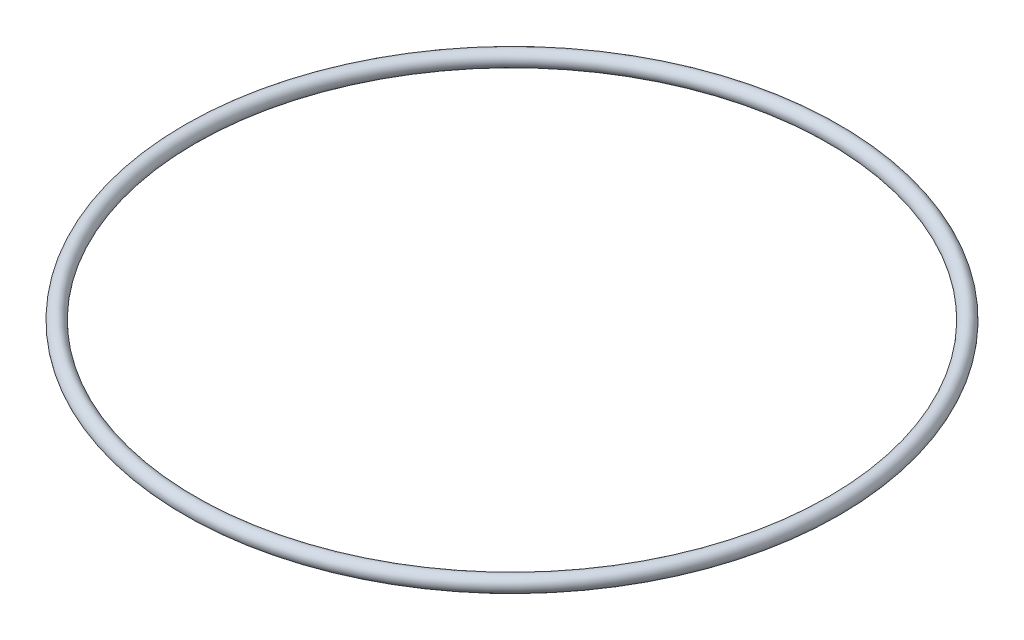
ISO-10303-21;
HEADER;
FILE_DESCRIPTION(('STEP AP214'),'2;1');
FILE_NAME('part.step','',(''),(''),'','','');
FILE_SCHEMA(('AUTOMOTIVE_DESIGN { 1 0 10303 214 1 1 1 1 }'));
ENDSEC;
DATA;
#1=APPLICATION_CONTEXT('core data for automotive mechanical design processes');
#2=APPLICATION_PROTOCOL_DEFINITION('international standard','automotive_design',2000,#1);
#3=PRODUCT_CONTEXT('',#1,'mechanical');
#4=PRODUCT('Part','Part','',(#3));
#5=PRODUCT_RELATED_PRODUCT_CATEGORY('part','',(#4));
#6=PRODUCT_DEFINITION_FORMATION('','',#4);
#7=PRODUCT_DEFINITION_CONTEXT('part definition',#1,'design');
#8=PRODUCT_DEFINITION('design','',#6,#7);
#9=PRODUCT_DEFINITION_SHAPE('','',#8);
#10=(LENGTH_UNIT() NAMED_UNIT(*) SI_UNIT(.MILLI.,.METRE.));
#11=(NAMED_UNIT(*) PLANE_ANGLE_UNIT() SI_UNIT($,.RADIAN.));
#12=(NAMED_UNIT(*) SI_UNIT($,.STERADIAN.) SOLID_ANGLE_UNIT());
#13=UNCERTAINTY_MEASURE_WITH_UNIT(LENGTH_MEASURE(1.E-05),#10,'distance_accuracy_value','');
#14=(GEOMETRIC_REPRESENTATION_CONTEXT(3) GLOBAL_UNCERTAINTY_ASSIGNED_CONTEXT((#13)) GLOBAL_UNIT_ASSIGNED_CONTEXT((#10,
#11,#12)) REPRESENTATION_CONTEXT('',''));
#15=CARTESIAN_POINT('',(0.,0.,0.));
#16=DIRECTION('',(0.,0.,1.));
#17=DIRECTION('',(1.,0.,0.));
#18=AXIS2_PLACEMENT_3D('',#15,#16,#17);
#19=CARTESIAN_POINT('',(0.,0.,0.));
#20=DIRECTION('',(0.,1.,0.));
#21=DIRECTION('',(-1.,0.,0.));
#22=AXIS2_PLACEMENT_3D('',#19,#20,#21);
#23=TOROIDAL_SURFACE('',#22,55.7149,1.3081);
#24=CARTESIAN_POINT('',(-57.023,0.,0.));
#25=VERTEX_POINT('',#24);
#26=VERTEX_LOOP('',#25);
#27=FACE_BOUND('',#26,.T.);
#28=ADVANCED_FACE('F30',(#27),#23,.T.);
#29=CLOSED_SHELL('',(#28));
#30=MANIFOLD_SOLID_BREP('B2',#29);
#31=ADVANCED_BREP_SHAPE_REPRESENTATION('',(#18,#30),#14);
#32=SHAPE_DEFINITION_REPRESENTATION(#9,#31);
ENDSEC;
END-ISO-10303-21;
